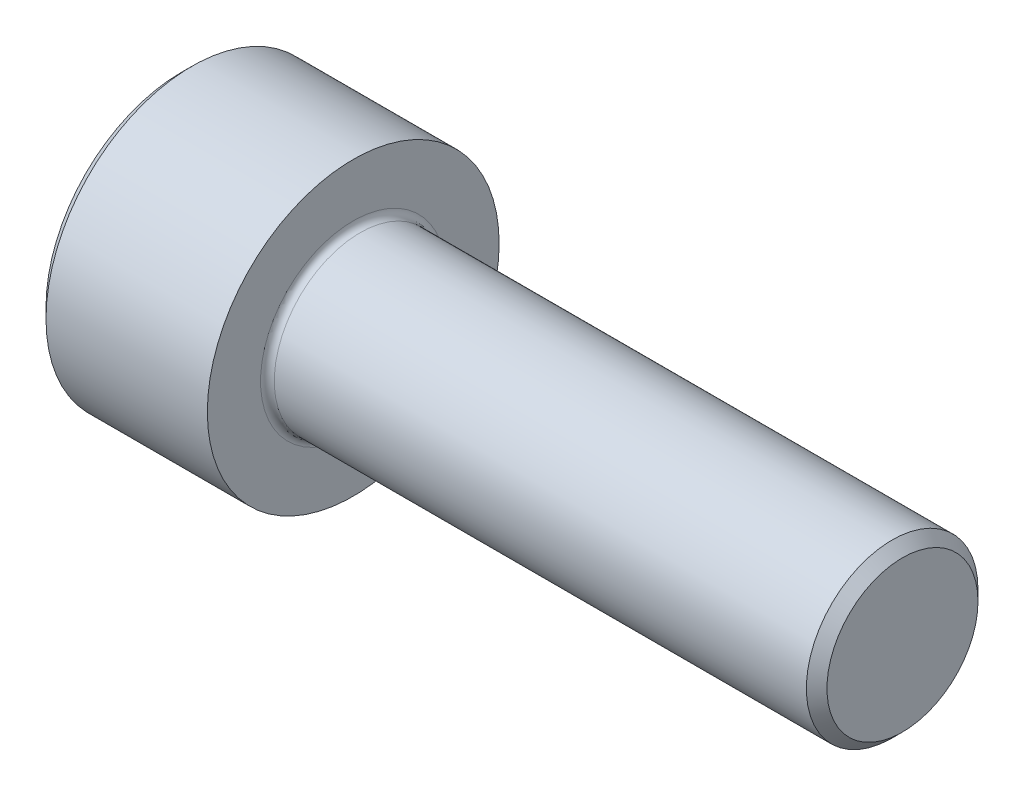
ISO-10303-21;
HEADER;
FILE_DESCRIPTION(('STEP AP214'),'2;1');
FILE_NAME('part.step','',(''),(''),'','','');
FILE_SCHEMA(('AUTOMOTIVE_DESIGN { 1 0 10303 214 1 1 1 1 }'));
ENDSEC;
DATA;
#1=APPLICATION_CONTEXT('core data for automotive mechanical design processes');
#2=APPLICATION_PROTOCOL_DEFINITION('international standard','automotive_design',2000,#1);
#3=PRODUCT_CONTEXT('',#1,'mechanical');
#4=PRODUCT('Part','Part','',(#3));
#5=PRODUCT_RELATED_PRODUCT_CATEGORY('part','',(#4));
#6=PRODUCT_DEFINITION_FORMATION('','',#4);
#7=PRODUCT_DEFINITION_CONTEXT('part definition',#1,'design');
#8=PRODUCT_DEFINITION('design','',#6,#7);
#9=PRODUCT_DEFINITION_SHAPE('','',#8);
#10=(LENGTH_UNIT() NAMED_UNIT(*) SI_UNIT(.MILLI.,.METRE.));
#11=(NAMED_UNIT(*) PLANE_ANGLE_UNIT() SI_UNIT($,.RADIAN.));
#12=(NAMED_UNIT(*) SI_UNIT($,.STERADIAN.) SOLID_ANGLE_UNIT());
#13=UNCERTAINTY_MEASURE_WITH_UNIT(LENGTH_MEASURE(1.E-05),#10,'distance_accuracy_value','');
#14=(GEOMETRIC_REPRESENTATION_CONTEXT(3) GLOBAL_UNCERTAINTY_ASSIGNED_CONTEXT((#13)) GLOBAL_UNIT_ASSIGNED_CONTEXT((#10,
#11,#12)) REPRESENTATION_CONTEXT('',''));
#15=CARTESIAN_POINT('',(0.,0.,0.));
#16=DIRECTION('',(0.,0.,1.));
#17=DIRECTION('',(1.,0.,0.));
#18=AXIS2_PLACEMENT_3D('',#15,#16,#17);
#19=CARTESIAN_POINT('',(5.,0.,0.));
#20=DIRECTION('',(-1.,0.,0.));
#21=DIRECTION('',(0.,0.,1.));
#22=AXIS2_PLACEMENT_3D('',#19,#20,#21);
#23=CYLINDRICAL_SURFACE('',#22,4.25);
#24=CARTESIAN_POINT('',(0.300000000000001,0.,0.));
#25=DIRECTION('',(-1.,0.,0.));
#26=DIRECTION('',(0.,0.,1.));
#27=AXIS2_PLACEMENT_3D('',#24,#25,#26);
#28=CIRCLE('',#27,4.25);
#29=CARTESIAN_POINT('',(0.300000000000001,0.,-4.25));
#30=VERTEX_POINT('',#29);
#31=EDGE_CURVE('E165',#30,#30,#28,.F.);
#32=ORIENTED_EDGE('',*,*,#31,.T.);
#33=EDGE_LOOP('',(#32));
#34=FACE_BOUND('',#33,.T.);
#35=CARTESIAN_POINT('',(5.,0.,0.));
#36=DIRECTION('',(-1.,0.,0.));
#37=DIRECTION('',(0.,0.,1.));
#38=AXIS2_PLACEMENT_3D('',#35,#36,#37);
#39=CIRCLE('',#38,4.25);
#40=CARTESIAN_POINT('',(5.,0.,4.25));
#41=VERTEX_POINT('',#40);
#42=EDGE_CURVE('E151',#41,#41,#39,.T.);
#43=ORIENTED_EDGE('',*,*,#42,.T.);
#44=EDGE_LOOP('',(#43));
#45=FACE_BOUND('',#44,.T.);
#46=ADVANCED_FACE('F41',(#34,#45),#23,.T.);
#47=CARTESIAN_POINT('',(5.,4.25,0.));
#48=DIRECTION('',(1.,0.,0.));
#49=DIRECTION('',(0.,0.,-1.));
#50=AXIS2_PLACEMENT_3D('',#47,#48,#49);
#51=PLANE('',#50);
#52=CARTESIAN_POINT('',(5.,0.,0.));
#53=DIRECTION('',(1.,0.,0.));
#54=DIRECTION('',(0.,0.,-1.));
#55=AXIS2_PLACEMENT_3D('',#52,#53,#54);
#56=CIRCLE('',#55,2.7);
#57=CARTESIAN_POINT('',(5.,0.,-2.7));
#58=VERTEX_POINT('',#57);
#59=EDGE_CURVE('E55',#58,#58,#56,.F.);
#60=ORIENTED_EDGE('',*,*,#59,.T.);
#61=EDGE_LOOP('',(#60));
#62=FACE_BOUND('',#61,.T.);
#63=ORIENTED_EDGE('',*,*,#42,.F.);
#64=EDGE_LOOP('',(#63));
#65=FACE_BOUND('',#64,.T.);
#66=ADVANCED_FACE('F173',(#62,#65),#51,.T.);
#67=CARTESIAN_POINT('',(0.,0.,0.));
#68=DIRECTION('',(-1.,0.,0.));
#69=DIRECTION('',(0.,0.,1.));
#70=AXIS2_PLACEMENT_3D('',#67,#68,#69);
#71=PLANE('',#70);
#72=CARTESIAN_POINT('',(0.,0.,0.));
#73=DIRECTION('',(-1.,0.,0.));
#74=DIRECTION('',(0.,0.,1.));
#75=AXIS2_PLACEMENT_3D('',#72,#73,#74);
#76=CIRCLE('',#75,2.36);
#77=CARTESIAN_POINT('',(0.,0.,2.36));
#78=VERTEX_POINT('',#77);
#79=EDGE_CURVE('E225',#78,#78,#76,.T.);
#80=ORIENTED_EDGE('',*,*,#79,.F.);
#81=EDGE_LOOP('',(#80));
#82=FACE_BOUND('',#81,.T.);
#83=CARTESIAN_POINT('',(0.,0.,0.));
#84=DIRECTION('',(-1.,0.,0.));
#85=DIRECTION('',(0.,0.,1.));
#86=AXIS2_PLACEMENT_3D('',#83,#84,#85);
#87=CIRCLE('',#86,3.95);
#88=CARTESIAN_POINT('',(0.,0.,-3.95));
#89=VERTEX_POINT('',#88);
#90=EDGE_CURVE('E162',#89,#89,#87,.T.);
#91=ORIENTED_EDGE('',*,*,#90,.T.);
#92=EDGE_LOOP('',(#91));
#93=FACE_BOUND('',#92,.T.);
#94=ADVANCED_FACE('F185',(#82,#93),#71,.T.);
#95=CARTESIAN_POINT('',(21.,0.,0.));
#96=DIRECTION('',(-1.,0.,0.));
#97=DIRECTION('',(0.,0.,1.));
#98=AXIS2_PLACEMENT_3D('',#95,#96,#97);
#99=CYLINDRICAL_SURFACE('',#98,2.5);
#100=CARTESIAN_POINT('',(5.2,0.,0.));
#101=DIRECTION('',(1.,0.,0.));
#102=DIRECTION('',(0.,0.,-1.));
#103=AXIS2_PLACEMENT_3D('',#100,#101,#102);
#104=CIRCLE('',#103,2.5);
#105=CARTESIAN_POINT('',(5.2,0.,-2.5));
#106=VERTEX_POINT('',#105);
#107=EDGE_CURVE('E168',#106,#106,#104,.T.);
#108=ORIENTED_EDGE('',*,*,#107,.T.);
#109=EDGE_LOOP('',(#108));
#110=FACE_BOUND('',#109,.T.);
#111=CARTESIAN_POINT('',(20.7,0.,0.));
#112=DIRECTION('',(1.,0.,0.));
#113=DIRECTION('',(0.,0.,-1.));
#114=AXIS2_PLACEMENT_3D('',#111,#112,#113);
#115=CIRCLE('',#114,2.5);
#116=CARTESIAN_POINT('',(20.7,0.,-2.5));
#117=VERTEX_POINT('',#116);
#118=EDGE_CURVE('E158',#117,#117,#115,.F.);
#119=ORIENTED_EDGE('',*,*,#118,.T.);
#120=EDGE_LOOP('',(#119));
#121=FACE_BOUND('',#120,.T.);
#122=ADVANCED_FACE('F181',(#110,#121),#99,.T.);
#123=CARTESIAN_POINT('',(21.,0.,0.));
#124=DIRECTION('',(1.,0.,0.));
#125=DIRECTION('',(0.,0.,-1.));
#126=AXIS2_PLACEMENT_3D('',#123,#124,#125);
#127=PLANE('',#126);
#128=CARTESIAN_POINT('',(21.,0.,0.));
#129=DIRECTION('',(1.,0.,0.));
#130=DIRECTION('',(0.,0.,-1.));
#131=AXIS2_PLACEMENT_3D('',#128,#129,#130);
#132=CIRCLE('',#131,2.2);
#133=CARTESIAN_POINT('',(21.,0.,-2.2));
#134=VERTEX_POINT('',#133);
#135=EDGE_CURVE('E155',#134,#134,#132,.T.);
#136=ORIENTED_EDGE('',*,*,#135,.T.);
#137=EDGE_LOOP('',(#136));
#138=FACE_BOUND('',#137,.T.);
#139=ADVANCED_FACE('F184',(#138),#127,.T.);
#140=CARTESIAN_POINT('',(21.,0.,0.));
#141=DIRECTION('',(-1.,0.,0.));
#142=DIRECTION('',(0.,0.,1.));
#143=AXIS2_PLACEMENT_3D('',#140,#141,#142);
#144=CONICAL_SURFACE('',#143,2.2,0.78539816339745);
#145=ORIENTED_EDGE('',*,*,#118,.F.);
#146=EDGE_LOOP('',(#145));
#147=FACE_BOUND('',#146,.T.);
#148=ORIENTED_EDGE('',*,*,#135,.F.);
#149=EDGE_LOOP('',(#148));
#150=FACE_BOUND('',#149,.T.);
#151=ADVANCED_FACE('F189',(#147,#150),#144,.T.);
#152=CARTESIAN_POINT('',(0.,0.,0.));
#153=DIRECTION('',(1.,0.,0.));
#154=DIRECTION('',(0.,0.,-1.));
#155=AXIS2_PLACEMENT_3D('',#152,#153,#154);
#156=CONICAL_SURFACE('',#155,3.95,0.78539816339745);
#157=CARTESIAN_POINT('',(0.300000000000001,0.,-4.25));
#158=CARTESIAN_POINT('',(0.296875000000001,0.,-4.246875));
#159=CARTESIAN_POINT('',(0.293750000000001,0.,-4.24375));
#160=CARTESIAN_POINT('',(0.287500000000001,0.,-4.2375));
#161=CARTESIAN_POINT('',(0.284375000000001,0.,-4.234375));
#162=CARTESIAN_POINT('',(0.278125000000001,0.,-4.228125));
#163=CARTESIAN_POINT('',(0.275000000000001,0.,-4.225));
#164=CARTESIAN_POINT('',(0.268750000000001,0.,-4.21875));
#165=CARTESIAN_POINT('',(0.265625000000001,0.,-4.215625));
#166=CARTESIAN_POINT('',(0.259375000000001,0.,-4.209375));
#167=CARTESIAN_POINT('',(0.256250000000001,0.,-4.20625));
#168=CARTESIAN_POINT('',(0.250000000000001,0.,-4.2));
#169=CARTESIAN_POINT('',(0.246875000000001,0.,-4.196875));
#170=CARTESIAN_POINT('',(0.240625000000001,0.,-4.190625));
#171=CARTESIAN_POINT('',(0.237500000000001,0.,-4.1875));
#172=CARTESIAN_POINT('',(0.231250000000001,0.,-4.18125));
#173=CARTESIAN_POINT('',(0.228125000000001,0.,-4.178125));
#174=CARTESIAN_POINT('',(0.221875000000001,0.,-4.171875));
#175=CARTESIAN_POINT('',(0.218750000000001,0.,-4.16875));
#176=CARTESIAN_POINT('',(0.212500000000001,0.,-4.1625));
#177=CARTESIAN_POINT('',(0.209375000000001,0.,-4.159375));
#178=CARTESIAN_POINT('',(0.203125000000001,0.,-4.153125));
#179=CARTESIAN_POINT('',(0.200000000000001,0.,-4.15));
#180=CARTESIAN_POINT('',(0.193750000000001,0.,-4.14375));
#181=CARTESIAN_POINT('',(0.190625000000001,0.,-4.140625));
#182=CARTESIAN_POINT('',(0.184375000000001,0.,-4.134375));
#183=CARTESIAN_POINT('',(0.181250000000001,0.,-4.13125));
#184=CARTESIAN_POINT('',(0.175,0.,-4.125));
#185=CARTESIAN_POINT('',(0.171875,0.,-4.121875));
#186=CARTESIAN_POINT('',(0.165625,0.,-4.115625));
#187=CARTESIAN_POINT('',(0.162500000000001,0.,-4.1125));
#188=CARTESIAN_POINT('',(0.156250000000001,0.,-4.10625));
#189=CARTESIAN_POINT('',(0.153125,0.,-4.103125));
#190=CARTESIAN_POINT('',(0.146875,0.,-4.096875));
#191=CARTESIAN_POINT('',(0.14375,0.,-4.09375));
#192=CARTESIAN_POINT('',(0.1375,0.,-4.0875));
#193=CARTESIAN_POINT('',(0.134375,0.,-4.084375));
#194=CARTESIAN_POINT('',(0.128125,0.,-4.078125));
#195=CARTESIAN_POINT('',(0.125,0.,-4.075));
#196=CARTESIAN_POINT('',(0.11875,0.,-4.06875));
#197=CARTESIAN_POINT('',(0.115625,0.,-4.065625));
#198=CARTESIAN_POINT('',(0.109375,0.,-4.059375));
#199=CARTESIAN_POINT('',(0.10625,0.,-4.05625));
#200=CARTESIAN_POINT('',(0.1,0.,-4.05));
#201=CARTESIAN_POINT('',(0.0968750000000002,0.,-4.046875));
#202=CARTESIAN_POINT('',(0.0906250000000002,0.,-4.040625));
#203=CARTESIAN_POINT('',(0.0875000000000003,0.,-4.0375));
#204=CARTESIAN_POINT('',(0.0812500000000003,0.,-4.03125));
#205=CARTESIAN_POINT('',(0.0781250000000002,0.,-4.028125));
#206=CARTESIAN_POINT('',(0.0718750000000002,0.,-4.021875));
#207=CARTESIAN_POINT('',(0.0687500000000002,0.,-4.01875));
#208=CARTESIAN_POINT('',(0.0625000000000002,0.,-4.0125));
#209=CARTESIAN_POINT('',(0.0593750000000001,0.,-4.009375));
#210=CARTESIAN_POINT('',(0.0531250000000001,0.,-4.003125));
#211=CARTESIAN_POINT('',(0.0500000000000002,0.,-4.));
#212=CARTESIAN_POINT('',(0.0437500000000002,0.,-3.99375));
#213=CARTESIAN_POINT('',(0.0406250000000002,0.,-3.990625));
#214=CARTESIAN_POINT('',(0.034375,0.,-3.984375));
#215=CARTESIAN_POINT('',(0.03125,0.,-3.98125));
#216=CARTESIAN_POINT('',(0.025,0.,-3.975));
#217=CARTESIAN_POINT('',(0.0218750000000001,0.,-3.971875));
#218=CARTESIAN_POINT('',(0.0156250000000001,0.,-3.965625));
#219=CARTESIAN_POINT('',(0.0125000000000001,0.,-3.9625));
#220=CARTESIAN_POINT('',(0.00625,0.,-3.95625));
#221=CARTESIAN_POINT('',(0.00312499999999994,0.,-3.953125));
#222=CARTESIAN_POINT('',(0.,0.,-3.95));
#223=B_SPLINE_CURVE_WITH_KNOTS('',3,(#157,#158,#159,#160,#161,#162,#163,#164,#165,#166,#167,
#168,#169,#170,#171,#172,#173,#174,#175,#176,#177,#178,#179,#180,#181,#182,#183,#184,#185,#186,
#187,#188,#189,#190,#191,#192,#193,#194,#195,#196,#197,#198,#199,#200,#201,#202,#203,#204,#205,
#206,#207,#208,#209,#210,#211,#212,#213,#214,#215,#216,#217,#218,#219,#220,#221,#222),
.UNSPECIFIED.,.F.,.F.,(4,2,2,2,2,2,2,2,2,2,2,2,2,2,2,2,2,2,2,2,2,2,2,2,2,2,2,2,2,2,2,2,4),(0.,
0.0132582521472477,0.0265165042944953,0.0397747564417436,0.0530330085889913,0.066291260736239,
0.0795495128834866,0.0928077650307349,0.106066017177983,0.11932426932523,0.132582521472478,
0.145840773619726,0.159099025766974,0.172357277914221,0.185615530061469,0.198873782208717,
0.212132034355965,0.225390286503213,0.23864853865046,0.251906790797709,0.265165042944956,
0.278423295092204,0.291681547239452,0.3049397993867,0.318198051533948,0.331456303681195,
0.344714555828443,0.357972807975691,0.371231060122939,0.384489312270187,0.397747564417435,
0.411005816564683,0.42426406871193),.UNSPECIFIED.);
#224=EDGE_CURVE('BSEAM178',#30,#89,#223,.T.);
#225=ORIENTED_EDGE('',*,*,#31,.F.);
#226=ORIENTED_EDGE('',*,*,#90,.F.);
#227=ORIENTED_EDGE('',*,*,#224,.T.);
#228=ORIENTED_EDGE('',*,*,#224,.F.);
#229=EDGE_LOOP('',(#225,#227,#226,#228));
#230=FACE_BOUND('',#229,.T.);
#231=ADVANCED_FACE('F178',(#230),#156,.T.);
#232=CARTESIAN_POINT('',(5.2,0.,0.));
#233=DIRECTION('',(1.,0.,0.));
#234=DIRECTION('',(0.,0.,-1.));
#235=AXIS2_PLACEMENT_3D('',#232,#233,#234);
#236=TOROIDAL_SURFACE('',#235,2.7,0.2);
#237=ORIENTED_EDGE('',*,*,#59,.F.);
#238=EDGE_LOOP('',(#237));
#239=FACE_BOUND('',#238,.T.);
#240=ORIENTED_EDGE('',*,*,#107,.F.);
#241=EDGE_LOOP('',(#240));
#242=FACE_BOUND('',#241,.T.);
#243=ADVANCED_FACE('F43',(#239,#242),#236,.F.);
#244=CARTESIAN_POINT('',(1.36254663528752,0.,0.));
#245=DIRECTION('',(-1.,0.,0.));
#246=DIRECTION('',(0.,0.,1.));
#247=AXIS2_PLACEMENT_3D('',#244,#245,#246);
#248=CONICAL_SURFACE('',#247,0.,1.0471975511966);
#249=ORIENTED_EDGE('',*,*,#79,.T.);
#250=EDGE_LOOP('',(#249));
#251=FACE_BOUND('',#250,.T.);
#252=CARTESIAN_POINT('',(0.00114663039059456,-2.35801396942427,0.000199999999999783));
#253=CARTESIAN_POINT('',(0.0310719544641244,-2.30620434112643,-0.0895369085331304));
#254=CARTESIAN_POINT('',(0.0582883068145113,-2.25394749715947,-0.180048417327096));
#255=CARTESIAN_POINT('',(0.105795551860266,-2.14852885809166,-0.362638856257306));
#256=CARTESIAN_POINT('',(0.126069636807196,-2.09536518933862,-0.454721031654331));
#257=CARTESIAN_POINT('',(0.157630337855869,-1.989696741055,-0.637744152838537));
#258=CARTESIAN_POINT('',(0.169126987878244,-1.93720822335038,-0.728656932316917));
#259=CARTESIAN_POINT('',(0.182853561887061,-1.83198411193462,-0.910910439470299));
#260=CARTESIAN_POINT('',(0.185094850582316,-1.77924890088665,-1.00225050435324));
#261=CARTESIAN_POINT('',(0.180441315546048,-1.68070359685174,-1.17293597778903));
#262=CARTESIAN_POINT('',(0.174689095267468,-1.63487877941828,-1.25230688983136));
#263=CARTESIAN_POINT('',(0.156455098337901,-1.54352770417093,-1.41053159348581));
#264=CARTESIAN_POINT('',(0.143967088176106,-1.49800176250927,-1.48938483750623));
#265=CARTESIAN_POINT('',(0.112746913550451,-1.40646221803311,-1.64793597944064));
#266=CARTESIAN_POINT('',(0.0938823593799548,-1.36046020568797,-1.72761380207284));
#267=CARTESIAN_POINT('',(0.0510668117777676,-1.26914243528183,-1.88578082005018));
#268=CARTESIAN_POINT('',(0.0271258836938428,-1.22382550658505,-1.96427204299598));
#269=CARTESIAN_POINT('',(0.00114663039059532,-1.17883377963138,-2.0422));
#270=B_SPLINE_CURVE_WITH_KNOTS('',3,(#252,#253,#254,#255,#256,#257,#258,#259,#260,#261,#262,
#263,#264,#265,#266,#267,#268,#269),.UNSPECIFIED.,.F.,.F.,(4,2,2,2,2,2,2,2,4),(0.,
0.323689160915413,0.648156546457724,0.964592827312975,1.28064043857972,1.5558683362992,
1.83135137663325,2.112946464294,2.39398834560291),.UNSPECIFIED.);
#271=CARTESIAN_POINT('',(0.00121330195418112,-2.35789849937043,0.));
#272=VERTEX_POINT('',#271);
#273=CARTESIAN_POINT('',(0.0012133019541817,-1.17894924968522,-2.042));
#274=VERTEX_POINT('',#273);
#275=EDGE_CURVE('E119',#272,#274,#270,.T.);
#276=ORIENTED_EDGE('',*,*,#275,.T.);
#277=CARTESIAN_POINT('',(-1.18033017888237,-3.90242277004021,-2.042));
#278=CARTESIAN_POINT('',(-1.13358403363541,-3.8110286762732,-2.042));
#279=CARTESIAN_POINT('',(-1.08710733981963,-3.71949550020187,-2.042));
#280=CARTESIAN_POINT('',(-0.994827235563669,-3.53608815220805,-2.042));
#281=CARTESIAN_POINT('',(-0.949023839448746,-3.44421397308224,-2.042));
#282=CARTESIAN_POINT('',(-0.858148940947571,-3.25990794253369,-2.042));
#283=CARTESIAN_POINT('',(-0.813078826703575,-3.16747540540989,-2.042));
#284=CARTESIAN_POINT('',(-0.723935489562972,-2.98212842293656,-2.042));
#285=CARTESIAN_POINT('',(-0.679862281226662,-2.88921397057275,-2.042));
#286=CARTESIAN_POINT('',(-0.5907360877533,-2.69805791882978,-2.042));
#287=CARTESIAN_POINT('',(-0.545747631822895,-2.59978614426473,-2.042));
#288=CARTESIAN_POINT('',(-0.457501647109631,-2.40246919702596,-2.042));
#289=CARTESIAN_POINT('',(-0.414244068672774,-2.30342404663578,-2.042));
#290=CARTESIAN_POINT('',(-0.329979356535895,-2.1044574176927,-2.042));
#291=CARTESIAN_POINT('',(-0.28897066969569,-2.00453660064979,-2.042));
#292=CARTESIAN_POINT('',(-0.209827092169145,-1.80352907200213,-2.042));
#293=CARTESIAN_POINT('',(-0.171692904519035,-1.70244208210408,-2.042));
#294=CARTESIAN_POINT('',(-0.0927305122130158,-1.48076120261793,-2.042));
#295=CARTESIAN_POINT('',(-0.0526341080774147,-1.35990261121784,-2.042));
#296=CARTESIAN_POINT('',(0.0203488437196818,-1.11605239095368,-2.042));
#297=CARTESIAN_POINT('',(0.0532391945108236,-0.993061924393671,-2.042));
#298=CARTESIAN_POINT('',(0.10882477786177,-0.747141326410264,-2.042));
#299=CARTESIAN_POINT('',(0.131698483408709,-0.624252734609998,-2.042));
#300=CARTESIAN_POINT('',(0.165687003758804,-0.376866293951327,-2.042));
#301=CARTESIAN_POINT('',(0.176808435477613,-0.252369390638983,-2.042));
#302=CARTESIAN_POINT('',(0.185838133917301,-0.00141932791971963,-2.042));
#303=CARTESIAN_POINT('',(0.183590845174486,0.125039716932464,-2.042));
#304=CARTESIAN_POINT('',(0.165852930865224,0.377031594965785,-2.042));
#305=CARTESIAN_POINT('',(0.150357076630658,0.502564042725216,-2.042));
#306=CARTESIAN_POINT('',(0.107736553225357,0.754103448980546,-2.042));
#307=CARTESIAN_POINT('',(0.0803895383222956,0.880071332368802,-2.042));
#308=CARTESIAN_POINT('',(0.0167625757937593,1.12969685843732,-2.042));
#309=CARTESIAN_POINT('',(-0.0195194308720745,1.25335396152881,-2.042));
#310=CARTESIAN_POINT('',(-0.0954331250191488,1.48865129778683,-2.042));
#311=CARTESIAN_POINT('',(-0.134560033322085,1.60045754853479,-2.042));
#312=CARTESIAN_POINT('',(-0.216928605074433,1.82255468178542,-2.042));
#313=CARTESIAN_POINT('',(-0.260171082521932,1.93284525955355,-2.042));
#314=CARTESIAN_POINT('',(-0.34975997362074,2.15226254497031,-2.042));
#315=CARTESIAN_POINT('',(-0.396109098471219,2.26138813707154,-2.042));
#316=CARTESIAN_POINT('',(-0.491127764957325,2.47862568054923,-2.042));
#317=CARTESIAN_POINT('',(-0.539797419193159,2.58673758243267,-2.042));
#318=CARTESIAN_POINT('',(-0.636271750810351,2.79639920974767,-2.042));
#319=CARTESIAN_POINT('',(-0.683984229993062,2.89799152345566,-2.042));
#320=CARTESIAN_POINT('',(-0.780667538655122,3.10057784608042,-2.042));
#321=CARTESIAN_POINT('',(-0.829638403446778,3.20157183810925,-2.042));
#322=CARTESIAN_POINT('',(-0.928439738812047,3.40277686048414,-2.042));
#323=CARTESIAN_POINT('',(-0.97826733101217,3.50298930746174,-2.042));
#324=CARTESIAN_POINT('',(-1.07873420252706,3.70299682587497,-2.042));
#325=CARTESIAN_POINT('',(-1.1293734170224,3.80279192984654,-2.042));
#326=CARTESIAN_POINT('',(-1.18033017888236,3.9024227700402,-2.042));
#327=B_SPLINE_CURVE_WITH_KNOTS('',3,(#277,#278,#279,#280,#281,#282,#283,#284,#285,#286,#287,
#288,#289,#290,#291,#292,#293,#294,#295,#296,#297,#298,#299,#300,#301,#302,#303,#304,#305,#306,
#307,#308,#309,#310,#311,#312,#313,#314,#315,#316,#317,#318,#319,#320,#321,#322,#323,#324,#325,
#326),.UNSPECIFIED.,.F.,.F.,(4,2,2,2,2,2,2,2,2,2,2,2,2,2,2,2,2,2,2,2,2,2,2,2,4),(0.,
0.307966717497043,0.615939977914769,0.924440797994917,1.23294612097467,1.55717322355227,
1.88139101828992,2.20538200490926,2.52945197686293,2.91129839368703,3.29294279584607,
3.66747914485864,4.04180450508119,4.42049388604931,4.79933278928617,5.18560978591739,
5.5719758822862,5.92723894464741,6.28257241933727,6.63822013929427,6.99388513412136,
7.33059019610314,7.66730471690663,8.0030505249346,8.33876965125659),.UNSPECIFIED.);
#328=CARTESIAN_POINT('',(0.00121330195418488,1.17894924968521,-2.042));
#329=VERTEX_POINT('',#328);
#330=EDGE_CURVE('E135',#274,#329,#327,.T.);
#331=ORIENTED_EDGE('',*,*,#330,.T.);
#332=CARTESIAN_POINT('',(0.00114663039059825,1.17883377963137,-2.0422));
#333=CARTESIAN_POINT('',(0.0310719544641279,1.23064340792922,-1.95246309146687));
#334=CARTESIAN_POINT('',(0.0582883068145148,1.28290025189617,-1.86195158267291));
#335=CARTESIAN_POINT('',(0.10579555186027,1.38831889096398,-1.6793611437427));
#336=CARTESIAN_POINT('',(0.1260696368072,1.44148255971702,-1.58727896834567));
#337=CARTESIAN_POINT('',(0.157630337855872,1.54715100800065,-1.40425584716147));
#338=CARTESIAN_POINT('',(0.169126987878247,1.59963952570527,-1.31334306768309));
#339=CARTESIAN_POINT('',(0.182853561887063,1.70486363712103,-1.13108956052971));
#340=CARTESIAN_POINT('',(0.185094850582319,1.75759884816899,-1.03974949564676));
#341=CARTESIAN_POINT('',(0.180441315546051,1.8561441522039,-0.869064022210977));
#342=CARTESIAN_POINT('',(0.174689095267471,1.90196896963737,-0.789693110168647));
#343=CARTESIAN_POINT('',(0.156455098337904,1.99332004488471,-0.631468406514198));
#344=CARTESIAN_POINT('',(0.143967088176109,2.03884598654638,-0.552615162493777));
#345=CARTESIAN_POINT('',(0.112746913550453,2.13038553102254,-0.394064020559364));
#346=CARTESIAN_POINT('',(0.0938823593799571,2.17638754336768,-0.314386197927168));
#347=CARTESIAN_POINT('',(0.0510668117777695,2.26770531377382,-0.156219179949827));
#348=CARTESIAN_POINT('',(0.0271258836938447,2.3130222424706,-0.0777279570040236));
#349=CARTESIAN_POINT('',(0.00114663039059742,2.35801396942427,0.000199999999995827));
#350=B_SPLINE_CURVE_WITH_KNOTS('',3,(#332,#333,#334,#335,#336,#337,#338,#339,#340,#341,#342,
#343,#344,#345,#346,#347,#348,#349),.UNSPECIFIED.,.F.,.F.,(4,2,2,2,2,2,2,2,4),(0.,
0.323689160915412,0.648156546457722,0.964592827312972,1.28064043857972,1.5558683362992,
1.83135137663325,2.112946464294,2.39398834560291),.UNSPECIFIED.);
#351=CARTESIAN_POINT('',(0.00121330195418372,2.35789849937043,0.));
#352=VERTEX_POINT('',#351);
#353=EDGE_CURVE('E253',#329,#352,#350,.T.);
#354=ORIENTED_EDGE('',*,*,#353,.T.);
#355=CARTESIAN_POINT('',(0.00114663039059709,2.35801396942427,-0.000200000000004279));
#356=CARTESIAN_POINT('',(0.0310719544641269,2.30620434112642,0.0895369085331256));
#357=CARTESIAN_POINT('',(0.058288306814514,2.25394749715947,0.180048417327091));
#358=CARTESIAN_POINT('',(0.105795551860269,2.14852885809166,0.362638856257301));
#359=CARTESIAN_POINT('',(0.126069636807199,2.09536518933862,0.454721031654325));
#360=CARTESIAN_POINT('',(0.157630337855872,1.98969674105499,0.637744152838531));
#361=CARTESIAN_POINT('',(0.169126987878247,1.93720822335037,0.72865693231691));
#362=CARTESIAN_POINT('',(0.182853561887064,1.83198411193461,0.910910439470292));
#363=CARTESIAN_POINT('',(0.185094850582319,1.77924890088665,1.00225050435324));
#364=CARTESIAN_POINT('',(0.180441315546052,1.68070359685174,1.17293597778902));
#365=CARTESIAN_POINT('',(0.174689095267471,1.63487877941827,1.25230688983135));
#366=CARTESIAN_POINT('',(0.156455098337904,1.54352770417093,1.4105315934858));
#367=CARTESIAN_POINT('',(0.14396708817611,1.49800176250926,1.48938483750622));
#368=CARTESIAN_POINT('',(0.112746913550454,1.40646221803311,1.64793597944064));
#369=CARTESIAN_POINT('',(0.0938823593799573,1.36046020568797,1.72761380207283));
#370=CARTESIAN_POINT('',(0.0510668117777695,1.26914243528183,1.88578082005018));
#371=CARTESIAN_POINT('',(0.0271258836938444,1.22382550658504,1.96427204299598));
#372=CARTESIAN_POINT('',(0.00114663039059691,1.17883377963138,2.0422));
#373=B_SPLINE_CURVE_WITH_KNOTS('',3,(#355,#356,#357,#358,#359,#360,#361,#362,#363,#364,#365,
#366,#367,#368,#369,#370,#371,#372),.UNSPECIFIED.,.F.,.F.,(4,2,2,2,2,2,2,2,4),(0.,
0.323689160915412,0.648156546457722,0.964592827312973,1.28064043857972,1.5558683362992,
1.83135137663325,2.112946464294,2.39398834560292),.UNSPECIFIED.);
#374=CARTESIAN_POINT('',(0.0012133019541835,1.17894924968521,2.042));
#375=VERTEX_POINT('',#374);
#376=EDGE_CURVE('E228',#352,#375,#373,.T.);
#377=ORIENTED_EDGE('',*,*,#376,.T.);
#378=CARTESIAN_POINT('',(-1.18033017888236,3.90242277004021,2.042));
#379=CARTESIAN_POINT('',(-1.13358403363541,3.81102867627319,2.042));
#380=CARTESIAN_POINT('',(-1.08710733981963,3.71949550020186,2.042));
#381=CARTESIAN_POINT('',(-0.994827235563667,3.53608815220805,2.042));
#382=CARTESIAN_POINT('',(-0.949023839448745,3.44421397308224,2.042));
#383=CARTESIAN_POINT('',(-0.85814894094757,3.25990794253369,2.042));
#384=CARTESIAN_POINT('',(-0.813078826703574,3.16747540540989,2.042));
#385=CARTESIAN_POINT('',(-0.723935489562971,2.98212842293655,2.042));
#386=CARTESIAN_POINT('',(-0.67986228122666,2.88921397057274,2.042));
#387=CARTESIAN_POINT('',(-0.590736087753298,2.69805791882978,2.042));
#388=CARTESIAN_POINT('',(-0.545747631822894,2.59978614426472,2.042));
#389=CARTESIAN_POINT('',(-0.45750164710963,2.40246919702596,2.042));
#390=CARTESIAN_POINT('',(-0.414244068672772,2.30342404663578,2.042));
#391=CARTESIAN_POINT('',(-0.329979356535893,2.10445741769269,2.042));
#392=CARTESIAN_POINT('',(-0.288970669695689,2.00453660064978,2.042));
#393=CARTESIAN_POINT('',(-0.209827092169143,1.80352907200213,2.042));
#394=CARTESIAN_POINT('',(-0.171692904519034,1.70244208210408,2.042));
#395=CARTESIAN_POINT('',(-0.0927305122130153,1.48076120261793,2.042));
#396=CARTESIAN_POINT('',(-0.052634108077414,1.35990261121784,2.042));
#397=CARTESIAN_POINT('',(0.0203488437196828,1.11605239095368,2.042));
#398=CARTESIAN_POINT('',(0.0532391945108244,0.993061924393669,2.042));
#399=CARTESIAN_POINT('',(0.108824777861771,0.747141326410262,2.042));
#400=CARTESIAN_POINT('',(0.13169848340871,0.624252734609996,2.042));
#401=CARTESIAN_POINT('',(0.165687003758805,0.376866293951324,2.042));
#402=CARTESIAN_POINT('',(0.176808435477613,0.25236939063898,2.042));
#403=CARTESIAN_POINT('',(0.185838133917301,0.00141932791971732,2.042));
#404=CARTESIAN_POINT('',(0.183590845174486,-0.125039716932466,2.042));
#405=CARTESIAN_POINT('',(0.165852930865223,-0.377031594965788,2.042));
#406=CARTESIAN_POINT('',(0.150357076630657,-0.502564042725218,2.042));
#407=CARTESIAN_POINT('',(0.107736553225356,-0.754103448980548,2.042));
#408=CARTESIAN_POINT('',(0.0803895383222949,-0.880071332368804,2.042));
#409=CARTESIAN_POINT('',(0.0167625757937586,-1.12969685843732,2.042));
#410=CARTESIAN_POINT('',(-0.0195194308720752,-1.25335396152881,2.042));
#411=CARTESIAN_POINT('',(-0.0954331250191497,-1.48865129778683,2.042));
#412=CARTESIAN_POINT('',(-0.134560033322086,-1.6004575485348,2.042));
#413=CARTESIAN_POINT('',(-0.216928605074434,-1.82255468178543,2.042));
#414=CARTESIAN_POINT('',(-0.260171082521934,-1.93284525955356,2.042));
#415=CARTESIAN_POINT('',(-0.349759973620742,-2.15226254497031,2.042));
#416=CARTESIAN_POINT('',(-0.396109098471221,-2.26138813707155,2.042));
#417=CARTESIAN_POINT('',(-0.491127764957328,-2.47862568054923,2.042));
#418=CARTESIAN_POINT('',(-0.539797419193163,-2.58673758243267,2.042));
#419=CARTESIAN_POINT('',(-0.636271750810355,-2.79639920974768,2.042));
#420=CARTESIAN_POINT('',(-0.683984229993066,-2.89799152345567,2.042));
#421=CARTESIAN_POINT('',(-0.780667538655126,-3.10057784608042,2.042));
#422=CARTESIAN_POINT('',(-0.829638403446783,-3.20157183810925,2.042));
#423=CARTESIAN_POINT('',(-0.928439738812052,-3.40277686048415,2.042));
#424=CARTESIAN_POINT('',(-0.978267331012174,-3.50298930746175,2.042));
#425=CARTESIAN_POINT('',(-1.07873420252706,-3.70299682587498,2.042));
#426=CARTESIAN_POINT('',(-1.1293734170224,-3.80279192984655,2.042));
#427=CARTESIAN_POINT('',(-1.18033017888237,-3.90242277004021,2.042));
#428=B_SPLINE_CURVE_WITH_KNOTS('',3,(#378,#379,#380,#381,#382,#383,#384,#385,#386,#387,#388,
#389,#390,#391,#392,#393,#394,#395,#396,#397,#398,#399,#400,#401,#402,#403,#404,#405,#406,#407,
#408,#409,#410,#411,#412,#413,#414,#415,#416,#417,#418,#419,#420,#421,#422,#423,#424,#425,#426,
#427),.UNSPECIFIED.,.F.,.F.,(4,2,2,2,2,2,2,2,2,2,2,2,2,2,2,2,2,2,2,2,2,2,2,2,4),(0.,
0.307966717497042,0.615939977914768,0.924440797994916,1.23294612097467,1.55717322355227,
1.88139101828992,2.20538200490925,2.52945197686293,2.91129839368703,3.29294279584607,
3.66747914485864,4.04180450508119,4.42049388604931,4.79933278928617,5.18560978591739,
5.57197588228619,5.92723894464741,6.28257241933727,6.63822013929428,6.99388513412137,
7.33059019610315,7.66730471690663,8.00305052493461,8.33876965125659),.UNSPECIFIED.);
#429=CARTESIAN_POINT('',(0.00121330195418227,-1.17894924968522,2.042));
#430=VERTEX_POINT('',#429);
#431=EDGE_CURVE('E61',#375,#430,#428,.T.);
#432=ORIENTED_EDGE('',*,*,#431,.T.);
#433=CARTESIAN_POINT('',(0.0011466303905957,-1.17883377963138,2.0422));
#434=CARTESIAN_POINT('',(0.0310719544641254,-1.23064340792923,1.95246309146687));
#435=CARTESIAN_POINT('',(0.0582883068145123,-1.28290025189618,1.8619515826729));
#436=CARTESIAN_POINT('',(0.105795551860268,-1.38831889096399,1.67936114374269));
#437=CARTESIAN_POINT('',(0.126069636807197,-1.44148255971703,1.58727896834567));
#438=CARTESIAN_POINT('',(0.15763033785587,-1.54715100800066,1.40425584716146));
#439=CARTESIAN_POINT('',(0.169126987878245,-1.59963952570528,1.31334306768308));
#440=CARTESIAN_POINT('',(0.182853561887061,-1.70486363712104,1.1310895605297));
#441=CARTESIAN_POINT('',(0.185094850582316,-1.757598848169,1.03974949564676));
#442=CARTESIAN_POINT('',(0.180441315546048,-1.85614415220391,0.869064022210974));
#443=CARTESIAN_POINT('',(0.174689095267468,-1.90196896963738,0.789693110168644));
#444=CARTESIAN_POINT('',(0.156455098337901,-1.99332004488472,0.631468406514194));
#445=CARTESIAN_POINT('',(0.143967088176106,-2.03884598654639,0.552615162493774));
#446=CARTESIAN_POINT('',(0.11274691355045,-2.13038553102254,0.39406402055936));
#447=CARTESIAN_POINT('',(0.093882359379954,-2.17638754336768,0.314386197927164));
#448=CARTESIAN_POINT('',(0.0510668117777666,-2.26770531377382,0.156219179949822));
#449=CARTESIAN_POINT('',(0.0271258836938419,-2.31302224247061,0.0777279570040194));
#450=CARTESIAN_POINT('',(0.00114663039059472,-2.35801396942427,-0.000200000000000341));
#451=B_SPLINE_CURVE_WITH_KNOTS('',3,(#433,#434,#435,#436,#437,#438,#439,#440,#441,#442,#443,
#444,#445,#446,#447,#448,#449,#450),.UNSPECIFIED.,.F.,.F.,(4,2,2,2,2,2,2,2,4),(0.,
0.323689160915413,0.648156546457723,0.964592827312974,1.28064043857972,1.5558683362992,
1.83135137663325,2.112946464294,2.39398834560291),.UNSPECIFIED.);
#452=EDGE_CURVE('E11',#430,#272,#451,.T.);
#453=ORIENTED_EDGE('',*,*,#452,.T.);
#454=EDGE_LOOP('',(#276,#331,#354,#377,#432,#453));
#455=FACE_BOUND('',#454,.T.);
#456=ADVANCED_FACE('F118',(#251,#455),#248,.F.);
#457=CARTESIAN_POINT('',(3.67894924968522,0.,0.));
#458=DIRECTION('',(-1.,0.,0.));
#459=DIRECTION('',(0.,0.,1.));
#460=AXIS2_PLACEMENT_3D('',#457,#458,#459);
#461=CONICAL_SURFACE('',#460,0.,1.0471975511966);
#462=CARTESIAN_POINT('',(2.5,0.,0.));
#463=DIRECTION('',(1.,0.,0.));
#464=DIRECTION('',(0.,0.,-1.));
#465=AXIS2_PLACEMENT_3D('',#462,#463,#464);
#466=CIRCLE('',#465,2.042);
#467=CARTESIAN_POINT('',(2.5,0.,-2.042));
#468=VERTEX_POINT('',#467);
#469=CARTESIAN_POINT('',(2.5,1.76842387452782,-1.02100000000001));
#470=VERTEX_POINT('',#469);
#471=EDGE_CURVE('E69',#468,#470,#466,.T.);
#472=ORIENTED_EDGE('',*,*,#471,.F.);
#473=CARTESIAN_POINT('',(2.5,-1.76842387452783,-1.021));
#474=VERTEX_POINT('',#473);
#475=EDGE_CURVE('E154',#474,#468,#466,.T.);
#476=ORIENTED_EDGE('',*,*,#475,.F.);
#477=CARTESIAN_POINT('',(2.5,-1.76842387452783,1.021));
#478=VERTEX_POINT('',#477);
#479=EDGE_CURVE('E325',#478,#474,#466,.T.);
#480=ORIENTED_EDGE('',*,*,#479,.F.);
#481=CARTESIAN_POINT('',(2.5,0.,2.042));
#482=VERTEX_POINT('',#481);
#483=EDGE_CURVE('E329',#482,#478,#466,.T.);
#484=ORIENTED_EDGE('',*,*,#483,.F.);
#485=CARTESIAN_POINT('',(2.5,1.76842387452783,1.021));
#486=VERTEX_POINT('',#485);
#487=EDGE_CURVE('E324',#486,#482,#466,.T.);
#488=ORIENTED_EDGE('',*,*,#487,.F.);
#489=EDGE_CURVE('E159',#470,#486,#466,.T.);
#490=ORIENTED_EDGE('',*,*,#489,.F.);
#491=EDGE_LOOP('',(#472,#476,#480,#484,#488,#490));
#492=FACE_BOUND('',#491,.T.);
#493=CARTESIAN_POINT('',(3.67894924968522,0.,0.));
#494=VERTEX_POINT('',#493);
#495=VERTEX_LOOP('',#494);
#496=FACE_BOUND('',#495,.T.);
#497=ADVANCED_FACE('F246',(#492,#496),#461,.F.);
#498=CARTESIAN_POINT('',(2.5,0.,0.));
#499=DIRECTION('',(-1.,0.,0.));
#500=DIRECTION('',(0.,0.,1.));
#501=AXIS2_PLACEMENT_3D('',#498,#499,#500);
#502=PLANE('',#501);
#503=DIRECTION('',(0.,-0.5,0.866025403784439));
#504=VECTOR('',#503,1.);
#505=CARTESIAN_POINT('',(2.5,-1.17894924968522,-2.042));
#506=LINE('',#505,#504);
#507=CARTESIAN_POINT('',(2.5,-1.17894924968522,-2.042));
#508=VERTEX_POINT('',#507);
#509=EDGE_CURVE('E319',#508,#474,#506,.T.);
#510=ORIENTED_EDGE('',*,*,#509,.T.);
#511=ORIENTED_EDGE('',*,*,#475,.T.);
#512=DIRECTION('',(0.,-1.,0.));
#513=VECTOR('',#512,1.);
#514=CARTESIAN_POINT('',(2.5,1.17894924968521,-2.042));
#515=LINE('',#514,#513);
#516=EDGE_CURVE('E147',#468,#508,#515,.T.);
#517=ORIENTED_EDGE('',*,*,#516,.T.);
#518=EDGE_LOOP('',(#510,#511,#517));
#519=FACE_BOUND('',#518,.T.);
#520=ADVANCED_FACE('F275',(#519),#502,.T.);
#521=CARTESIAN_POINT('',(2.5,1.17894924968521,-2.042));
#522=VERTEX_POINT('',#521);
#523=EDGE_CURVE('E142',#522,#468,#515,.T.);
#524=ORIENTED_EDGE('',*,*,#523,.T.);
#525=ORIENTED_EDGE('',*,*,#471,.T.);
#526=DIRECTION('',(0.,-0.500000000000002,-0.866025403784437));
#527=VECTOR('',#526,1.);
#528=CARTESIAN_POINT('',(2.5,2.35789849937043,0.));
#529=LINE('',#528,#527);
#530=EDGE_CURVE('E308',#470,#522,#529,.T.);
#531=ORIENTED_EDGE('',*,*,#530,.T.);
#532=EDGE_LOOP('',(#524,#525,#531));
#533=FACE_BOUND('',#532,.T.);
#534=ADVANCED_FACE('F347',(#533),#502,.T.);
#535=CARTESIAN_POINT('',(2.5,2.35789849937043,0.));
#536=VERTEX_POINT('',#535);
#537=EDGE_CURVE('E301',#536,#470,#529,.T.);
#538=ORIENTED_EDGE('',*,*,#537,.T.);
#539=ORIENTED_EDGE('',*,*,#489,.T.);
#540=DIRECTION('',(0.,0.499999999999999,-0.866025403784439));
#541=VECTOR('',#540,1.);
#542=CARTESIAN_POINT('',(2.5,1.17894924968521,2.042));
#543=LINE('',#542,#541);
#544=EDGE_CURVE('E312',#486,#536,#543,.T.);
#545=ORIENTED_EDGE('',*,*,#544,.T.);
#546=EDGE_LOOP('',(#538,#539,#545));
#547=FACE_BOUND('',#546,.T.);
#548=ADVANCED_FACE('F342',(#547),#502,.T.);
#549=CARTESIAN_POINT('',(2.5,1.17894924968521,2.042));
#550=VERTEX_POINT('',#549);
#551=EDGE_CURVE('E309',#550,#486,#543,.T.);
#552=ORIENTED_EDGE('',*,*,#551,.T.);
#553=ORIENTED_EDGE('',*,*,#487,.T.);
#554=DIRECTION('',(0.,1.,0.));
#555=VECTOR('',#554,1.);
#556=CARTESIAN_POINT('',(2.5,-1.17894924968522,2.042));
#557=LINE('',#556,#555);
#558=EDGE_CURVE('E316',#482,#550,#557,.T.);
#559=ORIENTED_EDGE('',*,*,#558,.T.);
#560=EDGE_LOOP('',(#552,#553,#559));
#561=FACE_BOUND('',#560,.T.);
#562=ADVANCED_FACE('F336',(#561),#502,.T.);
#563=DIRECTION('',(0.,0.5,0.866025403784438));
#564=VECTOR('',#563,1.);
#565=CARTESIAN_POINT('',(2.5,-2.35789849937043,0.));
#566=LINE('',#565,#564);
#567=CARTESIAN_POINT('',(2.5,-2.35789849937043,0.));
#568=VERTEX_POINT('',#567);
#569=EDGE_CURVE('E140',#568,#478,#566,.T.);
#570=ORIENTED_EDGE('',*,*,#569,.T.);
#571=ORIENTED_EDGE('',*,*,#479,.T.);
#572=EDGE_CURVE('E321',#474,#568,#506,.T.);
#573=ORIENTED_EDGE('',*,*,#572,.T.);
#574=EDGE_LOOP('',(#570,#571,#573));
#575=FACE_BOUND('',#574,.T.);
#576=ADVANCED_FACE('F339',(#575),#502,.T.);
#577=CARTESIAN_POINT('',(2.5,-1.17894924968522,2.042));
#578=VERTEX_POINT('',#577);
#579=EDGE_CURVE('E313',#578,#482,#557,.T.);
#580=ORIENTED_EDGE('',*,*,#579,.T.);
#581=ORIENTED_EDGE('',*,*,#483,.T.);
#582=EDGE_CURVE('E318',#478,#578,#566,.T.);
#583=ORIENTED_EDGE('',*,*,#582,.T.);
#584=EDGE_LOOP('',(#580,#581,#583));
#585=FACE_BOUND('',#584,.T.);
#586=ADVANCED_FACE('F338',(#585),#502,.T.);
#587=CARTESIAN_POINT('',(2.5,-2.35789849937043,0.));
#588=DIRECTION('',(0.,-0.866025403784438,0.5));
#589=DIRECTION('',(0.,-0.5,-0.866025403784439));
#590=AXIS2_PLACEMENT_3D('',#587,#588,#589);
#591=PLANE('',#590);
#592=ORIENTED_EDGE('',*,*,#452,.F.);
#593=DIRECTION('',(-1.,0.,0.));
#594=VECTOR('',#593,1.);
#595=CARTESIAN_POINT('',(2.5,-1.17894924968522,2.042));
#596=LINE('',#595,#594);
#597=EDGE_CURVE('E141',#578,#430,#596,.T.);
#598=ORIENTED_EDGE('',*,*,#597,.F.);
#599=ORIENTED_EDGE('',*,*,#582,.F.);
#600=ORIENTED_EDGE('',*,*,#569,.F.);
#601=DIRECTION('',(-1.,0.,0.));
#602=VECTOR('',#601,1.);
#603=CARTESIAN_POINT('',(2.5,-2.35789849937043,0.));
#604=LINE('',#603,#602);
#605=EDGE_CURVE('E130',#568,#272,#604,.T.);
#606=ORIENTED_EDGE('',*,*,#605,.T.);
#607=EDGE_LOOP('',(#592,#598,#599,#600,#606));
#608=FACE_BOUND('',#607,.T.);
#609=ADVANCED_FACE('F137',(#608),#591,.F.);
#610=CARTESIAN_POINT('',(2.5,-1.17894924968522,2.042));
#611=DIRECTION('',(0.,0.,1.));
#612=DIRECTION('',(1.,0.,0.));
#613=AXIS2_PLACEMENT_3D('',#610,#611,#612);
#614=PLANE('',#613);
#615=ORIENTED_EDGE('',*,*,#431,.F.);
#616=DIRECTION('',(-1.,0.,0.));
#617=VECTOR('',#616,1.);
#618=CARTESIAN_POINT('',(2.5,1.17894924968521,2.042));
#619=LINE('',#618,#617);
#620=EDGE_CURVE('E144',#550,#375,#619,.T.);
#621=ORIENTED_EDGE('',*,*,#620,.F.);
#622=ORIENTED_EDGE('',*,*,#558,.F.);
#623=ORIENTED_EDGE('',*,*,#579,.F.);
#624=ORIENTED_EDGE('',*,*,#597,.T.);
#625=EDGE_LOOP('',(#615,#621,#622,#623,#624));
#626=FACE_BOUND('',#625,.T.);
#627=ADVANCED_FACE('F242',(#626),#614,.F.);
#628=CARTESIAN_POINT('',(2.5,1.17894924968521,2.042));
#629=DIRECTION('',(0.,0.866025403784439,0.499999999999999));
#630=DIRECTION('',(0.,-0.499999999999999,0.866025403784439));
#631=AXIS2_PLACEMENT_3D('',#628,#629,#630);
#632=PLANE('',#631);
#633=ORIENTED_EDGE('',*,*,#376,.F.);
#634=DIRECTION('',(-1.,0.,0.));
#635=VECTOR('',#634,1.);
#636=CARTESIAN_POINT('',(2.5,2.35789849937043,0.));
#637=LINE('',#636,#635);
#638=EDGE_CURVE('E292',#536,#352,#637,.T.);
#639=ORIENTED_EDGE('',*,*,#638,.F.);
#640=ORIENTED_EDGE('',*,*,#544,.F.);
#641=ORIENTED_EDGE('',*,*,#551,.F.);
#642=ORIENTED_EDGE('',*,*,#620,.T.);
#643=EDGE_LOOP('',(#633,#639,#640,#641,#642));
#644=FACE_BOUND('',#643,.T.);
#645=ADVANCED_FACE('F278',(#644),#632,.F.);
#646=CARTESIAN_POINT('',(2.5,2.35789849937043,0.));
#647=DIRECTION('',(0.,0.866025403784437,-0.500000000000002));
#648=DIRECTION('',(0.,0.500000000000002,0.866025403784437));
#649=AXIS2_PLACEMENT_3D('',#646,#647,#648);
#650=PLANE('',#649);
#651=ORIENTED_EDGE('',*,*,#353,.F.);
#652=DIRECTION('',(-1.,0.,0.));
#653=VECTOR('',#652,1.);
#654=CARTESIAN_POINT('',(2.5,1.17894924968521,-2.042));
#655=LINE('',#654,#653);
#656=EDGE_CURVE('E302',#522,#329,#655,.T.);
#657=ORIENTED_EDGE('',*,*,#656,.F.);
#658=ORIENTED_EDGE('',*,*,#530,.F.);
#659=ORIENTED_EDGE('',*,*,#537,.F.);
#660=ORIENTED_EDGE('',*,*,#638,.T.);
#661=EDGE_LOOP('',(#651,#657,#658,#659,#660));
#662=FACE_BOUND('',#661,.T.);
#663=ADVANCED_FACE('F273',(#662),#650,.F.);
#664=CARTESIAN_POINT('',(2.5,1.17894924968521,-2.042));
#665=DIRECTION('',(0.,0.,-1.));
#666=DIRECTION('',(-1.,0.,0.));
#667=AXIS2_PLACEMENT_3D('',#664,#665,#666);
#668=PLANE('',#667);
#669=ORIENTED_EDGE('',*,*,#330,.F.);
#670=DIRECTION('',(-1.,0.,0.));
#671=VECTOR('',#670,1.);
#672=CARTESIAN_POINT('',(2.5,-1.17894924968522,-2.042));
#673=LINE('',#672,#671);
#674=EDGE_CURVE('E134',#508,#274,#673,.T.);
#675=ORIENTED_EDGE('',*,*,#674,.F.);
#676=ORIENTED_EDGE('',*,*,#516,.F.);
#677=ORIENTED_EDGE('',*,*,#523,.F.);
#678=ORIENTED_EDGE('',*,*,#656,.T.);
#679=EDGE_LOOP('',(#669,#675,#676,#677,#678));
#680=FACE_BOUND('',#679,.T.);
#681=ADVANCED_FACE('F270',(#680),#668,.F.);
#682=CARTESIAN_POINT('',(2.5,-1.17894924968522,-2.042));
#683=DIRECTION('',(0.,-0.866025403784439,-0.5));
#684=DIRECTION('',(0.,0.5,-0.866025403784439));
#685=AXIS2_PLACEMENT_3D('',#682,#683,#684);
#686=PLANE('',#685);
#687=ORIENTED_EDGE('',*,*,#275,.F.);
#688=ORIENTED_EDGE('',*,*,#605,.F.);
#689=ORIENTED_EDGE('',*,*,#572,.F.);
#690=ORIENTED_EDGE('',*,*,#509,.F.);
#691=ORIENTED_EDGE('',*,*,#674,.T.);
#692=EDGE_LOOP('',(#687,#688,#689,#690,#691));
#693=FACE_BOUND('',#692,.T.);
#694=ADVANCED_FACE('F128',(#693),#686,.F.);
#695=CLOSED_SHELL('',(#46,#66,#94,#122,#139,#151,#231,#243,#456,#497,#520,#534,#548,#562,#576,
#586,#609,#627,#645,#663,#681,#694));
#696=MANIFOLD_SOLID_BREP('B2',#695);
#697=ADVANCED_BREP_SHAPE_REPRESENTATION('',(#18,#696),#14);
#698=SHAPE_DEFINITION_REPRESENTATION(#9,#697);
ENDSEC;
END-ISO-10303-21;
